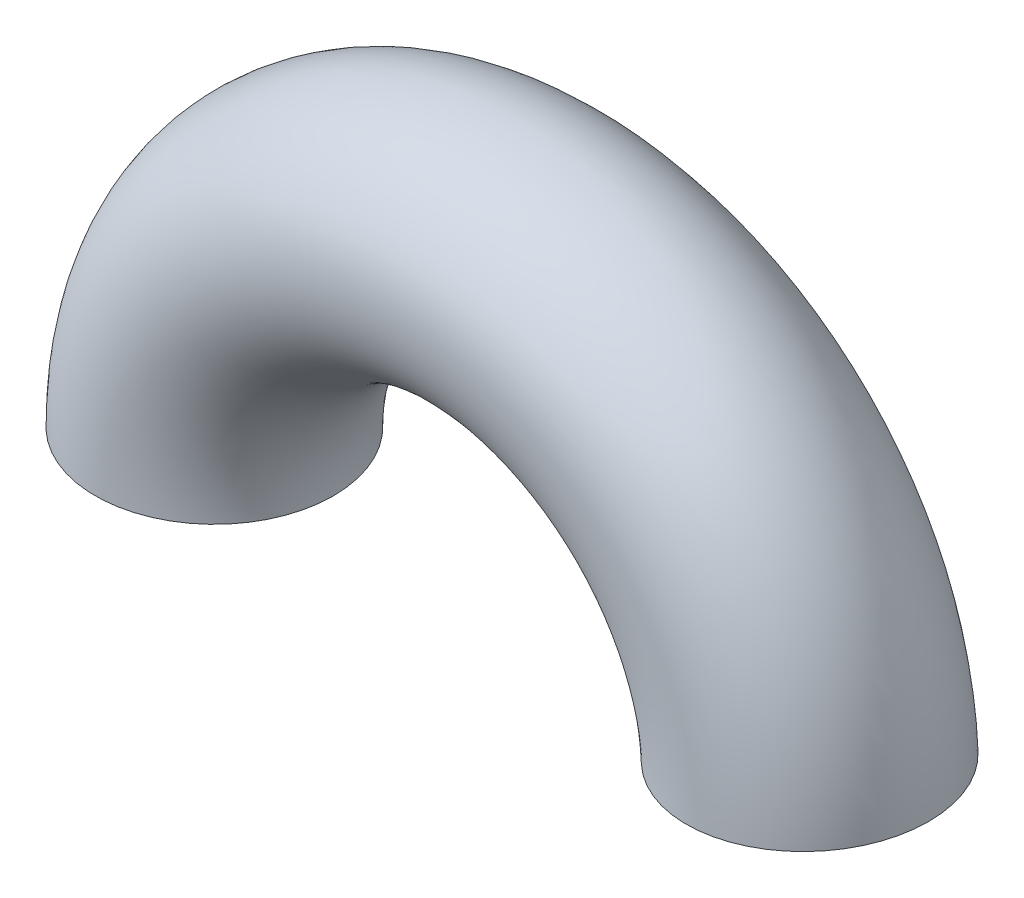
ISO-10303-21;
HEADER;
FILE_DESCRIPTION(('STEP AP214'),'2;1');
FILE_NAME('part.step','',(''),(''),'','','');
FILE_SCHEMA(('AUTOMOTIVE_DESIGN { 1 0 10303 214 1 1 1 1 }'));
ENDSEC;
DATA;
#1=APPLICATION_CONTEXT('core data for automotive mechanical design processes');
#2=APPLICATION_PROTOCOL_DEFINITION('international standard','automotive_design',2000,#1);
#3=PRODUCT_CONTEXT('',#1,'mechanical');
#4=PRODUCT('Part','Part','',(#3));
#5=PRODUCT_RELATED_PRODUCT_CATEGORY('part','',(#4));
#6=PRODUCT_DEFINITION_FORMATION('','',#4);
#7=PRODUCT_DEFINITION_CONTEXT('part definition',#1,'design');
#8=PRODUCT_DEFINITION('design','',#6,#7);
#9=PRODUCT_DEFINITION_SHAPE('','',#8);
#10=(LENGTH_UNIT() NAMED_UNIT(*) SI_UNIT(.MILLI.,.METRE.));
#11=(NAMED_UNIT(*) PLANE_ANGLE_UNIT() SI_UNIT($,.RADIAN.));
#12=(NAMED_UNIT(*) SI_UNIT($,.STERADIAN.) SOLID_ANGLE_UNIT());
#13=UNCERTAINTY_MEASURE_WITH_UNIT(LENGTH_MEASURE(1.E-05),#10,'distance_accuracy_value','');
#14=(GEOMETRIC_REPRESENTATION_CONTEXT(3) GLOBAL_UNCERTAINTY_ASSIGNED_CONTEXT((#13)) GLOBAL_UNIT_ASSIGNED_CONTEXT((#10,
#11,#12)) REPRESENTATION_CONTEXT('',''));
#15=CARTESIAN_POINT('',(0.,0.,0.));
#16=DIRECTION('',(0.,0.,1.));
#17=DIRECTION('',(1.,0.,0.));
#18=AXIS2_PLACEMENT_3D('',#15,#16,#17);
#19=CARTESIAN_POINT('',(0.,0.,0.));
#20=DIRECTION('',(0.,1.,0.));
#21=DIRECTION('',(0.,0.,1.));
#22=AXIS2_PLACEMENT_3D('',#19,#20,#21);
#23=PLANE('',#22);
#24=CARTESIAN_POINT('',(0.,0.,0.));
#25=DIRECTION('',(0.,1.,0.));
#26=DIRECTION('',(0.,0.,1.));
#27=AXIS2_PLACEMENT_3D('',#24,#25,#26);
#28=CIRCLE('',#27,4.5);
#29=CARTESIAN_POINT('',(-4.5,0.,0.));
#30=VERTEX_POINT('',#29);
#31=EDGE_CURVE('E54',#30,#30,#28,.T.);
#32=ORIENTED_EDGE('',*,*,#31,.T.);
#33=EDGE_LOOP('',(#32));
#34=FACE_BOUND('',#33,.T.);
#35=CARTESIAN_POINT('',(0.,0.,0.));
#36=DIRECTION('',(0.,1.,0.));
#37=DIRECTION('',(0.,0.,1.));
#38=AXIS2_PLACEMENT_3D('',#35,#36,#37);
#39=CIRCLE('',#38,5.);
#40=CARTESIAN_POINT('',(-5.,0.,0.));
#41=VERTEX_POINT('',#40);
#42=EDGE_CURVE('E50',#41,#41,#39,.T.);
#43=ORIENTED_EDGE('',*,*,#42,.F.);
#44=EDGE_LOOP('',(#43));
#45=FACE_BOUND('',#44,.T.);
#46=ADVANCED_FACE('F41',(#34,#45),#23,.F.);
#47=CARTESIAN_POINT('',(24.9912745555804,0.466968925208059,0.));
#48=DIRECTION('',(0.0373575140166447,-0.999301964446431,0.));
#49=DIRECTION('',(0.,0.,1.));
#50=AXIS2_PLACEMENT_3D('',#47,#48,#49);
#51=PLANE('',#50);
#52=CARTESIAN_POINT('',(24.9912745555804,0.466968925208059,0.));
#53=DIRECTION('',(0.0373575140166447,-0.999301964446431,0.));
#54=DIRECTION('',(0.999301964446431,0.0373575140166447,0.));
#55=AXIS2_PLACEMENT_3D('',#52,#53,#54);
#56=CIRCLE('',#55,4.5);
#57=CARTESIAN_POINT('',(29.4881333955893,0.63507773828296,0.));
#58=VERTEX_POINT('',#57);
#59=EDGE_CURVE('E51',#58,#58,#56,.T.);
#60=ORIENTED_EDGE('',*,*,#59,.F.);
#61=EDGE_LOOP('',(#60));
#62=FACE_BOUND('',#61,.T.);
#63=CARTESIAN_POINT('',(24.9912745555804,0.466968925208059,0.));
#64=DIRECTION('',(0.0373575140166447,-0.999301964446431,0.));
#65=DIRECTION('',(0.,0.,1.));
#66=AXIS2_PLACEMENT_3D('',#63,#64,#65);
#67=CIRCLE('',#66,5.);
#68=CARTESIAN_POINT('',(29.9877843778125,0.653756495291283,0.));
#69=VERTEX_POINT('',#68);
#70=EDGE_CURVE('E10',#69,#69,#67,.T.);
#71=ORIENTED_EDGE('',*,*,#70,.T.);
#72=EDGE_LOOP('',(#71));
#73=FACE_BOUND('',#72,.T.);
#74=ADVANCED_FACE('F72',(#62,#73),#51,.T.);
#75=CARTESIAN_POINT('',(12.5,0.,0.));
#76=DIRECTION('',(0.,0.,-1.));
#77=DIRECTION('',(-1.,0.,0.));
#78=AXIS2_PLACEMENT_3D('',#75,#76,#77);
#79=TOROIDAL_SURFACE('',#78,12.5,5.);
#80=CARTESIAN_POINT('',(12.5,0.,0.));
#81=DIRECTION('',(0.,0.,-1.));
#82=DIRECTION('',(-1.,0.,0.));
#83=AXIS2_PLACEMENT_3D('',#80,#81,#82);
#84=CIRCLE('',#83,17.5);
#85=EDGE_CURVE('',#41,#69,#84,.T.);
#86=ORIENTED_EDGE('',*,*,#42,.T.);
#87=ORIENTED_EDGE('',*,*,#70,.F.);
#88=ORIENTED_EDGE('',*,*,#85,.T.);
#89=ORIENTED_EDGE('',*,*,#85,.F.);
#90=EDGE_LOOP('',(#86,#88,#87,#89));
#91=FACE_BOUND('',#90,.T.);
#92=ADVANCED_FACE('F63',(#91),#79,.T.);
#93=CARTESIAN_POINT('',(12.5,0.,0.));
#94=DIRECTION('',(0.,0.,-1.));
#95=DIRECTION('',(-1.,0.,0.));
#96=AXIS2_PLACEMENT_3D('',#93,#94,#95);
#97=TOROIDAL_SURFACE('',#96,12.5,4.5);
#98=CARTESIAN_POINT('',(12.5,0.,0.));
#99=DIRECTION('',(0.,0.,-1.));
#100=DIRECTION('',(-1.,0.,0.));
#101=AXIS2_PLACEMENT_3D('',#98,#99,#100);
#102=CIRCLE('',#101,17.);
#103=EDGE_CURVE('',#30,#58,#102,.T.);
#104=ORIENTED_EDGE('',*,*,#31,.F.);
#105=ORIENTED_EDGE('',*,*,#59,.T.);
#106=ORIENTED_EDGE('',*,*,#103,.T.);
#107=ORIENTED_EDGE('',*,*,#103,.F.);
#108=EDGE_LOOP('',(#104,#106,#105,#107));
#109=FACE_BOUND('',#108,.T.);
#110=ADVANCED_FACE('F64',(#109),#97,.F.);
#111=CLOSED_SHELL('',(#46,#74,#92,#110));
#112=MANIFOLD_SOLID_BREP('B2',#111);
#113=ADVANCED_BREP_SHAPE_REPRESENTATION('',(#18,#112),#14);
#114=SHAPE_DEFINITION_REPRESENTATION(#9,#113);
ENDSEC;
END-ISO-10303-21;
